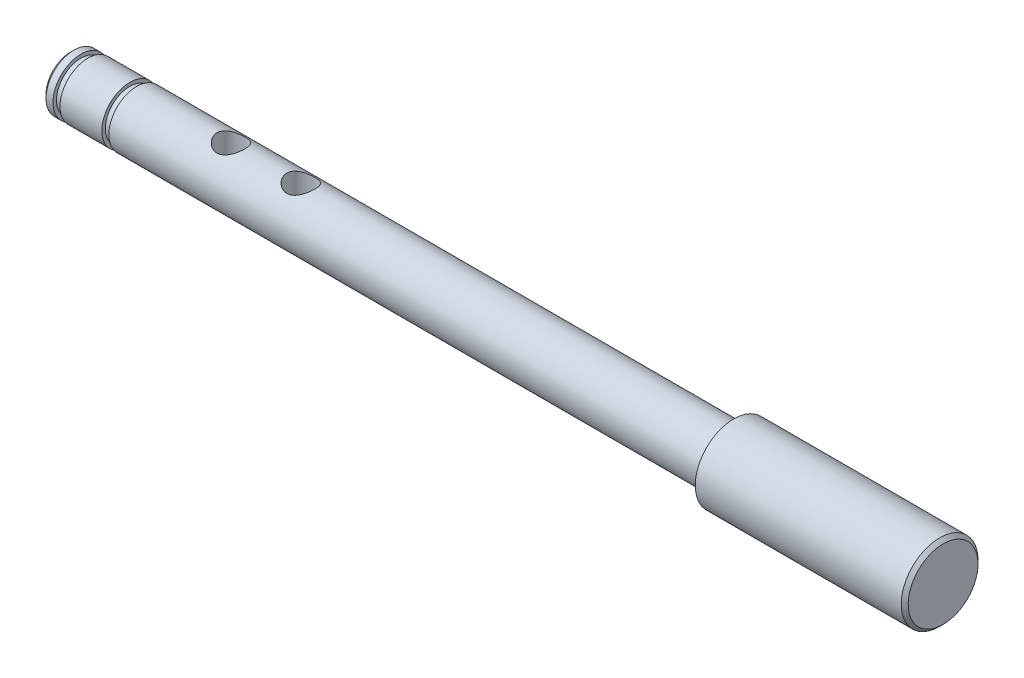
ISO-10303-21;
HEADER;
FILE_DESCRIPTION(('STEP AP214'),'2;1');
FILE_NAME('part.step','',(''),(''),'','','');
FILE_SCHEMA(('AUTOMOTIVE_DESIGN { 1 0 10303 214 1 1 1 1 }'));
ENDSEC;
DATA;
#1=APPLICATION_CONTEXT('core data for automotive mechanical design processes');
#2=APPLICATION_PROTOCOL_DEFINITION('international standard','automotive_design',2000,#1);
#3=PRODUCT_CONTEXT('',#1,'mechanical');
#4=PRODUCT('Part','Part','',(#3));
#5=PRODUCT_RELATED_PRODUCT_CATEGORY('part','',(#4));
#6=PRODUCT_DEFINITION_FORMATION('','',#4);
#7=PRODUCT_DEFINITION_CONTEXT('part definition',#1,'design');
#8=PRODUCT_DEFINITION('design','',#6,#7);
#9=PRODUCT_DEFINITION_SHAPE('','',#8);
#10=(LENGTH_UNIT() NAMED_UNIT(*) SI_UNIT(.MILLI.,.METRE.));
#11=(NAMED_UNIT(*) PLANE_ANGLE_UNIT() SI_UNIT($,.RADIAN.));
#12=(NAMED_UNIT(*) SI_UNIT($,.STERADIAN.) SOLID_ANGLE_UNIT());
#13=UNCERTAINTY_MEASURE_WITH_UNIT(LENGTH_MEASURE(1.E-05),#10,'distance_accuracy_value','');
#14=(GEOMETRIC_REPRESENTATION_CONTEXT(3) GLOBAL_UNCERTAINTY_ASSIGNED_CONTEXT((#13)) GLOBAL_UNIT_ASSIGNED_CONTEXT((#10,
#11,#12)) REPRESENTATION_CONTEXT('',''));
#15=CARTESIAN_POINT('',(0.,0.,0.));
#16=DIRECTION('',(0.,0.,1.));
#17=DIRECTION('',(1.,0.,0.));
#18=AXIS2_PLACEMENT_3D('',#15,#16,#17);
#19=CARTESIAN_POINT('',(-32.9998700625875,-1.79110198894605E-12,4.44089209850063E-13));
#20=DIRECTION('',(-1.,0.,0.));
#21=DIRECTION('',(0.,-1.,0.));
#22=AXIS2_PLACEMENT_3D('',#19,#20,#21);
#23=CYLINDRICAL_SURFACE('',#22,4.00000000000019);
#24=CARTESIAN_POINT('',(-23.4998700625875,-1.82145964977565E-12,0.));
#25=DIRECTION('',(-1.,0.,0.));
#26=DIRECTION('',(0.,-1.,0.));
#27=AXIS2_PLACEMENT_3D('',#24,#25,#26);
#28=CIRCLE('',#27,3.99999999999961);
#29=CARTESIAN_POINT('',(-23.4998700625875,-4.00000000000143,0.));
#30=VERTEX_POINT('',#29);
#31=EDGE_CURVE('E129',#30,#30,#28,.T.);
#32=ORIENTED_EDGE('',*,*,#31,.F.);
#33=EDGE_LOOP('',(#32));
#34=FACE_BOUND('',#33,.T.);
#35=CARTESIAN_POINT('',(60.9999999999999,-2.09901540593194E-12,0.));
#36=DIRECTION('',(-1.,0.,0.));
#37=DIRECTION('',(0.,-1.,0.));
#38=AXIS2_PLACEMENT_3D('',#35,#36,#37);
#39=CIRCLE('',#38,4.00000000000077);
#40=CARTESIAN_POINT('',(60.9999999999999,-4.00000000000288,0.));
#41=VERTEX_POINT('',#40);
#42=EDGE_CURVE('E133',#41,#41,#39,.T.);
#43=ORIENTED_EDGE('',*,*,#42,.T.);
#44=EDGE_LOOP('',(#43));
#45=FACE_BOUND('',#44,.T.);
#46=CARTESIAN_POINT('',(-9.99987006258754,3.46410161513611,-2.));
#47=CARTESIAN_POINT('',(-10.1040832680619,3.46411185715724,-1.99999158748818));
#48=CARTESIAN_POINT('',(-10.2084322391213,3.46887633544813,-1.99179963610415));
#49=CARTESIAN_POINT('',(-10.4139252398181,3.48724701668907,-1.95944672579986));
#50=CARTESIAN_POINT('',(-10.5150620658353,3.50087179788018,-1.9352522109561));
#51=CARTESIAN_POINT('',(-10.7107732190345,3.53498701489839,-1.87219981597994));
#52=CARTESIAN_POINT('',(-10.8053793214369,3.55544089069007,-1.83341988295927));
#53=CARTESIAN_POINT('',(-10.9867185130638,3.60085327290969,-1.74253507245076));
#54=CARTESIAN_POINT('',(-11.0734511760243,3.62581202301087,-1.6904294741005));
#55=CARTESIAN_POINT('',(-11.2444815057209,3.67993738819123,-1.56933307453707));
#56=CARTESIAN_POINT('',(-11.3279883301794,3.70928127464941,-1.49930407053465));
#57=CARTESIAN_POINT('',(-11.4826868431583,3.7674396538196,-1.34650761698157));
#58=CARTESIAN_POINT('',(-11.5538723887916,3.79625387610095,-1.26373385204793));
#59=CARTESIAN_POINT('',(-11.686604363776,3.85242953961492,-1.0809791263122));
#60=CARTESIAN_POINT('',(-11.7471775980108,3.87956212851074,-0.980214377886781));
#61=CARTESIAN_POINT('',(-11.8501517693746,3.92701512183998,-0.768314053336717));
#62=CARTESIAN_POINT('',(-11.8925641749384,3.94733982363466,-0.657185076311878));
#63=CARTESIAN_POINT('',(-11.9548793851188,3.97760922491889,-0.436089887818738));
#64=CARTESIAN_POINT('',(-11.9761691152796,3.98818960442572,-0.326603580968638));
#65=CARTESIAN_POINT('',(-12.0002022999565,4.0001516769101,-0.105141257404283));
#66=CARTESIAN_POINT('',(-12.0029569761838,4.00153893568768,0.00683321168550699));
#67=CARTESIAN_POINT('',(-11.9903767146424,3.99525963832959,0.219665048849873));
#68=CARTESIAN_POINT('',(-11.976594031544,3.98836991784217,0.320642398354399));
#69=CARTESIAN_POINT('',(-11.9341083747795,3.9674849051927,0.518627543836237));
#70=CARTESIAN_POINT('',(-11.9054042846354,3.95348908132604,0.615635042187779));
#71=CARTESIAN_POINT('',(-11.8337049304076,3.91943166575159,0.804618783139351));
#72=CARTESIAN_POINT('',(-11.7905174362434,3.8992888305824,0.896506847030569));
#73=CARTESIAN_POINT('',(-11.6913432301848,3.85475291973209,1.07195360302695));
#74=CARTESIAN_POINT('',(-11.635351935983,3.83035832314803,1.15550929767769));
#75=CARTESIAN_POINT('',(-11.5060793595215,3.77688788798292,1.32034732179684));
#76=CARTESIAN_POINT('',(-11.4316640059355,3.74758751996181,1.40066815005911));
#77=CARTESIAN_POINT('',(-11.2706906127272,3.68908681173455,1.54820874059617));
#78=CARTESIAN_POINT('',(-11.1841233180395,3.65988656531093,1.61541842314937));
#79=CARTESIAN_POINT('',(-10.9945736777395,3.60288312184806,1.73901066928533));
#80=CARTESIAN_POINT('',(-10.8908980164791,3.57528639981249,1.7944346299567));
#81=CARTESIAN_POINT('',(-10.6739947198695,3.52750900556985,1.8866382260028));
#82=CARTESIAN_POINT('',(-10.5607771965524,3.5073206009197,1.92343731642218));
#83=CARTESIAN_POINT('',(-10.3374410400221,3.47889271633905,1.97436042205059));
#84=CARTESIAN_POINT('',(-10.2277878245005,3.46983311696828,1.99005024424051));
#85=CARTESIAN_POINT('',(-10.0070673795545,3.46235838723054,2.00303389322317));
#86=CARTESIAN_POINT('',(-9.89600120434804,3.46393573778459,2.00034071463008));
#87=CARTESIAN_POINT('',(-9.68856222543021,3.47668673081004,1.97807208668794));
#88=CARTESIAN_POINT('',(-9.59191116037186,3.48679175013141,1.96037563342517));
#89=CARTESIAN_POINT('',(-9.40313449004562,3.51388043102517,1.91139256926558));
#90=CARTESIAN_POINT('',(-9.31101036109409,3.53086632009906,1.88010155724817));
#91=CARTESIAN_POINT('',(-9.12904740078249,3.57072444159149,1.80329517721064));
#92=CARTESIAN_POINT('',(-9.03951202888162,3.59383286485956,1.75718812738596));
#93=CARTESIAN_POINT('',(-8.86893151950867,3.64312238994329,1.65257412803216));
#94=CARTESIAN_POINT('',(-8.78789077555718,3.66930506710131,1.59406080866537));
#95=CARTESIAN_POINT('',(-8.62591252754489,3.72575996912507,1.45767433439747));
#96=CARTESIAN_POINT('',(-8.54627576116965,3.75613166308405,1.37829054462786));
#97=CARTESIAN_POINT('',(-8.40104558658272,3.81468469955633,1.20680899079926));
#98=CARTESIAN_POINT('',(-8.33545692206074,3.84286530015296,1.11470694931997));
#99=CARTESIAN_POINT('',(-8.21872261075491,3.89482723381699,0.917070725108073));
#100=CARTESIAN_POINT('',(-8.16800382642073,3.91847283343719,0.811246195112641));
#101=CARTESIAN_POINT('',(-8.08559425461783,3.95766709918613,0.591044729318167));
#102=CARTESIAN_POINT('',(-8.05388675890341,3.97322287353232,0.476675402917978));
#103=CARTESIAN_POINT('',(-8.01313293510242,3.99335016363007,0.253959364540128));
#104=CARTESIAN_POINT('',(-8.00227431392328,3.99879855814101,0.146022887268676));
#105=CARTESIAN_POINT('',(-7.99818352859188,4.00084260752206,-0.0702519714695585));
#106=CARTESIAN_POINT('',(-8.00494519405867,3.99744136141467,-0.178590198981228));
#107=CARTESIAN_POINT('',(-8.03470288690396,3.98267937668341,-0.38507598613647));
#108=CARTESIAN_POINT('',(-8.05659979989663,3.97185789309273,-0.483424641057028));
#109=CARTESIAN_POINT('',(-8.11452402239424,3.94384187353218,-0.674891898931207));
#110=CARTESIAN_POINT('',(-8.15055335829445,3.92664642364257,-0.768009749669449));
#111=CARTESIAN_POINT('',(-8.237324317579,3.88651861393011,-0.950846833596434));
#112=CARTESIAN_POINT('',(-8.28862928233956,3.8633723400523,-1.04025036572257));
#113=CARTESIAN_POINT('',(-8.40378535070577,3.81376266675854,-1.20954920326811));
#114=CARTESIAN_POINT('',(-8.46764221668912,3.78729774583261,-1.28944011444321));
#115=CARTESIAN_POINT('',(-8.61346669814701,3.73057218840415,-1.44582833859494));
#116=CARTESIAN_POINT('',(-8.69660424338807,3.70019591725901,-1.52119665879171));
#117=CARTESIAN_POINT('',(-8.87476229089389,3.64126158628396,-1.65732528393981));
#118=CARTESIAN_POINT('',(-8.96979319394814,3.61270515130617,-1.71807266521248));
#119=CARTESIAN_POINT('',(-9.17317895671781,3.55999186256587,-1.82486714716819));
#120=CARTESIAN_POINT('',(-9.28185997332297,3.53600256268367,-1.87038902381896));
#121=CARTESIAN_POINT('',(-9.45044818221872,3.50696218132201,-1.92395929504752));
#122=CARTESIAN_POINT('',(-9.50751788317847,3.49844389329232,-1.9393566614791));
#123=CARTESIAN_POINT('',(-9.62310262008791,3.48406059323369,-1.9650806980502));
#124=CARTESIAN_POINT('',(-9.68161661534188,3.47819372635886,-1.97541091343302));
#125=CARTESIAN_POINT('',(-9.78347085183488,3.47059023668593,-1.98872932961218));
#126=CARTESIAN_POINT('',(-9.82660311983768,3.4681638973165,-1.99295091983745));
#127=CARTESIAN_POINT('',(-9.91310575568049,3.46491740045012,-1.99858810035559));
#128=CARTESIAN_POINT('',(-9.95647613925427,3.46409735040327,-2.00000350293316));
#129=CARTESIAN_POINT('',(-9.99987006258754,3.46410161513611,-2.));
#130=B_SPLINE_CURVE_WITH_KNOTS('',3,(#46,#47,#48,#49,#50,#51,#52,#53,#54,#55,#56,#57,#58,#59,
#60,#61,#62,#63,#64,#65,#66,#67,#68,#69,#70,#71,#72,#73,#74,#75,#76,#77,#78,#79,#80,#81,#82,#83,
#84,#85,#86,#87,#88,#89,#90,#91,#92,#93,#94,#95,#96,#97,#98,#99,#100,#101,#102,#103,#104,#105,
#106,#107,#108,#109,#110,#111,#112,#113,#114,#115,#116,#117,#118,#119,#120,#121,#122,#123,#124,
#125,#126,#127,#128,#129),.UNSPECIFIED.,.T.,.F.,(4,2,2,2,2,2,2,2,2,2,2,2,2,2,2,2,2,2,2,2,2,2,2,
2,2,2,2,2,2,2,2,2,2,2,2,2,2,2,2,2,2,4),(0.,0.312464245189459,0.625585785649657,
0.937057191861695,1.24854545093126,1.5857246250373,1.9230714217281,2.28315784481574,
2.6430165393181,2.97726969939913,3.31132047376138,3.61632194973119,3.92134625038937,
4.23059069466335,4.53994598704602,4.87854382917855,5.21740096495926,5.57777683462976,
5.93777548427477,6.26924581712487,6.60048186380813,6.89548366852111,7.19058104876171,
7.49934592816229,7.80826972444165,8.15613487165315,8.50411729960509,8.86128362830021,
9.21813559621617,9.54224540783045,9.86624173592014,10.1688884974706,10.471578670281,
10.7872150144303,11.1029966020554,11.4502048370424,11.7977188569441,12.1562149808131,
12.3351395323575,12.5139387197528,12.6440387634038,12.7741475095883),.UNSPECIFIED.);
#131=CARTESIAN_POINT('',(-9.99987006258754,3.46410161513611,-2.));
#132=VERTEX_POINT('',#131);
#133=EDGE_CURVE('E53',#132,#132,#130,.T.);
#134=ORIENTED_EDGE('',*,*,#133,.F.);
#135=EDGE_LOOP('',(#134));
#136=FACE_BOUND('',#135,.T.);
#137=CARTESIAN_POINT('',(-7.9998700625875,-4.00000000000206,4.44089209850063E-13));
#138=CARTESIAN_POINT('',(-7.99987666722182,-3.99999426810289,0.105143925902829));
#139=CARTESIAN_POINT('',(-8.00821020882959,-3.99580982039721,0.210413199395417));
#140=CARTESIAN_POINT('',(-8.04117582327063,-3.97948312074522,0.417840470537916));
#141=CARTESIAN_POINT('',(-8.06583884858324,-3.96732575658045,0.519992173427284));
#142=CARTESIAN_POINT('',(-8.13025767982081,-3.93632558806958,0.717867089760966));
#143=CARTESIAN_POINT('',(-8.16995483108341,-3.91750878355284,0.813613605878493));
#144=CARTESIAN_POINT('',(-8.26301130531745,-3.87491553031734,0.996945233613578));
#145=CARTESIAN_POINT('',(-8.31636955108528,-3.8511394726726,1.08453098798055));
#146=CARTESIAN_POINT('',(-8.43890456155819,-3.79912516516331,1.25501563552428));
#147=CARTESIAN_POINT('',(-8.50884302106686,-3.77070398255281,1.33731042224468));
#148=CARTESIAN_POINT('',(-8.66091302108164,-3.71319940493692,1.48955888973443));
#149=CARTESIAN_POINT('',(-8.74305376613247,-3.68411552418277,1.55950316621401));
#150=CARTESIAN_POINT('',(-8.92483676163441,-3.62597902394902,1.690504000901));
#151=CARTESIAN_POINT('',(-9.02534225927952,-3.59710373940468,1.75045067110367));
#152=CARTESIAN_POINT('',(-9.2366047345601,-3.54571957544846,1.85233645378201));
#153=CARTESIAN_POINT('',(-9.3473543200331,-3.52320615214188,1.89428842993357));
#154=CARTESIAN_POINT('',(-9.56920027343143,-3.48915734075827,1.95626488437802));
#155=CARTESIAN_POINT('',(-9.67987896672241,-3.47704543167635,1.97745171416144));
#156=CARTESIAN_POINT('',(-9.90382773814659,-3.46363779897263,2.00085398661804));
#157=CARTESIAN_POINT('',(-10.0170951443299,-3.46233138686785,2.00308817674657));
#158=CARTESIAN_POINT('',(-10.2284421112184,-3.47021860514706,1.98937457434505));
#159=CARTESIAN_POINT('',(-10.3267181250337,-3.47817527324236,1.97556911907409));
#160=CARTESIAN_POINT('',(-10.5193138813337,-3.50152457467909,1.93387969811427));
#161=CARTESIAN_POINT('',(-10.6136323531982,-3.51691957663761,1.90599124779569));
#162=CARTESIAN_POINT('',(-10.798328327719,-3.55374952825692,1.83641956077242));
#163=CARTESIAN_POINT('',(-10.8885628601593,-3.57531681328208,1.79443013423244));
#164=CARTESIAN_POINT('',(-11.0611386477677,-3.62206808563017,1.6980833753363));
#165=CARTESIAN_POINT('',(-11.1434763337878,-3.64725369560588,1.64372048762505));
#166=CARTESIAN_POINT('',(-11.308912568074,-3.70226315806778,1.51613210982564));
#167=CARTESIAN_POINT('',(-11.39078380974,-3.73227020473702,1.4413889167388));
#168=CARTESIAN_POINT('',(-11.5413408997695,-3.79095246601025,1.27911115748318));
#169=CARTESIAN_POINT('',(-11.6100204466554,-3.81962703917811,1.19157051314902));
#170=CARTESIAN_POINT('',(-11.735241384647,-3.87403974566132,1.00103301166421));
#171=CARTESIAN_POINT('',(-11.791071007479,-3.89957968324215,0.897507183199387));
#172=CARTESIAN_POINT('',(-11.8840641206735,-3.94315762242686,0.680932430978287));
#173=CARTESIAN_POINT('',(-11.9212424326178,-3.96120157887312,0.567891152531313));
#174=CARTESIAN_POINT('',(-11.9728208700209,-3.98648667483078,0.34553298332217));
#175=CARTESIAN_POINT('',(-11.9888525340811,-3.99449876602824,0.236683061097352));
#176=CARTESIAN_POINT('',(-12.0027995248565,-4.00146026918411,0.0175591998992844));
#177=CARTESIAN_POINT('',(-12.0007234338664,-4.00041397442843,-0.0927140397392894));
#178=CARTESIAN_POINT('',(-11.97945668575,-3.98982384507076,-0.302465943971513));
#179=CARTESIAN_POINT('',(-11.9616049971276,-3.98094491376541,-0.402118816099414));
#180=CARTESIAN_POINT('',(-11.9113939187973,-3.95644342629886,-0.596813784603457));
#181=CARTESIAN_POINT('',(-11.8790329296805,-3.9408201266903,-0.691855371381754));
#182=CARTESIAN_POINT('',(-11.7998731297214,-3.9036850282738,-0.877777216898771));
#183=CARTESIAN_POINT('',(-11.7526879623548,-3.88201763539461,-0.968460794011268));
#184=CARTESIAN_POINT('',(-11.6456549912943,-3.83487948635036,-1.1409227233984));
#185=CARTESIAN_POINT('',(-11.5858017933967,-3.80940711134083,-1.22269725955321));
#186=CARTESIAN_POINT('',(-11.448349211926,-3.75416442672602,-1.38353537857841));
#187=CARTESIAN_POINT('',(-11.369584325697,-3.72421769687197,-1.4615441556378));
#188=CARTESIAN_POINT('',(-11.2000197600319,-3.66524783217838,-1.60371264223749));
#189=CARTESIAN_POINT('',(-11.1092118248916,-3.63622534800299,-1.66786277142379));
#190=CARTESIAN_POINT('',(-10.9125827542415,-3.58102384413187,-1.78341582895801));
#191=CARTESIAN_POINT('',(-10.8062475303984,-3.55505059178325,-1.8340509916001));
#192=CARTESIAN_POINT('',(-10.5848499274374,-3.51148144588472,-1.91616565186908));
#193=CARTESIAN_POINT('',(-10.4697990096537,-3.49387476443707,-1.94766983173414));
#194=CARTESIAN_POINT('',(-10.2460496168181,-3.47123002051814,-1.9877233749338));
#195=CARTESIAN_POINT('',(-10.1378015557171,-3.46514766930338,-1.99818599281056));
#196=CARTESIAN_POINT('',(-9.92097592825845,-3.46330709283415,-2.00137830875186));
#197=CARTESIAN_POINT('',(-9.81239852511176,-3.46754439252989,-1.99411569324614));
#198=CARTESIAN_POINT('',(-9.60890305952069,-3.48475724102361,-1.96385225118623));
#199=CARTESIAN_POINT('',(-9.51366912229817,-3.49686188965523,-1.94241662868547));
#200=CARTESIAN_POINT('',(-9.32825382373885,-3.52742032375513,-1.88635071644857));
#201=CARTESIAN_POINT('',(-9.23807409840337,-3.54587615139548,-1.85171618232014));
#202=CARTESIAN_POINT('',(-9.05862036061438,-3.58857060729281,-1.76763149060151));
#203=CARTESIAN_POINT('',(-8.96981425892961,-3.61311444792045,-1.71734227563125));
#204=CARTESIAN_POINT('',(-8.80132099022519,-3.66470663269924,-1.60430194327423));
#205=CARTESIAN_POINT('',(-8.72163860154532,-3.69175627591428,-1.5415443424827));
#206=CARTESIAN_POINT('',(-8.56358609787808,-3.74924646316395,-1.39640665332238));
#207=CARTESIAN_POINT('',(-8.48655185788691,-3.77969966613466,-1.31256884599404));
#208=CARTESIAN_POINT('',(-8.34734409571697,-3.8375550452007,-1.13230961246585));
#209=CARTESIAN_POINT('',(-8.28517858364764,-3.86495557252599,-1.03588144660989));
#210=CARTESIAN_POINT('',(-8.17739733716337,-3.91396019133281,-0.83186319356546));
#211=CARTESIAN_POINT('',(-8.13190172411468,-3.9355219298807,-0.72419900755306));
#212=CARTESIAN_POINT('',(-8.06025372707275,-3.97002682598179,-0.501484202275896));
#213=CARTESIAN_POINT('',(-8.03404636897598,-3.98299446726344,-0.386455599178016));
#214=CARTESIAN_POINT('',(-8.01207524041602,-3.99390923827163,-0.225203892981608));
#215=CARTESIAN_POINT('',(-8.00750478085488,-3.99618730680708,-0.180323758882888));
#216=CARTESIAN_POINT('',(-8.0014007315594,-3.99923393953836,-0.0903034636098355));
#217=CARTESIAN_POINT('',(-7.9998672256471,-4.00000246206968,-0.0451632952928621));
#218=CARTESIAN_POINT('',(-7.9998700625875,-4.00000000000206,4.44089209850063E-13));
#219=B_SPLINE_CURVE_WITH_KNOTS('',3,(#137,#138,#139,#140,#141,#142,#143,#144,#145,#146,#147,
#148,#149,#150,#151,#152,#153,#154,#155,#156,#157,#158,#159,#160,#161,#162,#163,#164,#165,#166,
#167,#168,#169,#170,#171,#172,#173,#174,#175,#176,#177,#178,#179,#180,#181,#182,#183,#184,#185,
#186,#187,#188,#189,#190,#191,#192,#193,#194,#195,#196,#197,#198,#199,#200,#201,#202,#203,#204,
#205,#206,#207,#208,#209,#210,#211,#212,#213,#214,#215,#216,#217,#218),.UNSPECIFIED.,.T.,.F.,(4,
2,2,2,2,2,2,2,2,2,2,2,2,2,2,2,2,2,2,2,2,2,2,2,2,2,2,2,2,2,2,2,2,2,2,2,2,2,2,2,4),(0.,
0.315248514840347,0.631096299417941,0.945724310984405,1.26032752116317,1.59396351743618,
1.92785247530808,2.28763452861518,2.64715895796579,2.98516024280469,3.3228271465805,
3.62011424818653,3.91749607851367,4.22180480336992,4.52625042520472,4.86929882667772,
5.21251069197369,5.57166044428859,5.93052433824521,6.25966580942672,6.58865129022949,
6.89213813012243,7.19565843261866,7.50785712055821,7.82018901496719,8.16319221288871,
8.50643177230896,8.86629364323485,9.22569023890927,9.55058615006111,9.87534119729376,
10.1691586049772,10.463070575767,10.7767291356058,11.0905512228729,11.4425048551438,
11.7946476676253,12.1492802732707,12.502898172423,12.6383056026785,12.7737167702216),.UNSPECIFIED.);
#220=CARTESIAN_POINT('',(-7.9998700625875,-4.00000000000206,4.44089209850063E-13));
#221=VERTEX_POINT('',#220);
#222=EDGE_CURVE('E59',#221,#221,#219,.T.);
#223=ORIENTED_EDGE('',*,*,#222,.F.);
#224=EDGE_LOOP('',(#223));
#225=FACE_BOUND('',#224,.T.);
#226=CARTESIAN_POINT('',(0.000129937412454706,3.46410161513607,-1.99999999999956));
#227=CARTESIAN_POINT('',(-0.104083268061892,3.4641118571572,-1.99999158748747));
#228=CARTESIAN_POINT('',(-0.208432239121368,3.46887633544809,-1.99179963610395));
#229=CARTESIAN_POINT('',(-0.413925239818179,3.48724701668905,-1.95944672580006));
#230=CARTESIAN_POINT('',(-0.515062065835327,3.50087179788017,-1.93525221095617));
#231=CARTESIAN_POINT('',(-0.71077321903449,3.53498701489836,-1.87219981597987));
#232=CARTESIAN_POINT('',(-0.80537932143681,3.55544089069001,-1.8334198829592));
#233=CARTESIAN_POINT('',(-0.98671851306371,3.60085327290963,-1.74253507245092));
#234=CARTESIAN_POINT('',(-1.07345117602432,3.62581202301085,-1.69042947410091));
#235=CARTESIAN_POINT('',(-1.24448150572094,3.67993738819121,-1.56933307453751));
#236=CARTESIAN_POINT('',(-1.32798833017935,3.70928127464935,-1.49930407053486));
#237=CARTESIAN_POINT('',(-1.48268684315818,3.76743965381953,-1.34650761698155));
#238=CARTESIAN_POINT('',(-1.55387238879155,3.7962538761009,-1.26373385204794));
#239=CARTESIAN_POINT('',(-1.68660436377601,3.8524295396149,-1.08097912631222));
#240=CARTESIAN_POINT('',(-1.74717759801078,3.87956212851071,-0.980214377886777));
#241=CARTESIAN_POINT('',(-1.85015176937458,3.92701512183994,-0.768314053336699));
#242=CARTESIAN_POINT('',(-1.89256417493836,3.94733982363463,-0.657185076311871));
#243=CARTESIAN_POINT('',(-1.95487938511877,3.97760922491886,-0.436089887818723));
#244=CARTESIAN_POINT('',(-1.97616911527964,3.98818960442569,-0.326603580968603));
#245=CARTESIAN_POINT('',(-2.00020229995655,4.00015167691007,-0.105141257404209));
#246=CARTESIAN_POINT('',(-2.00295697618383,4.00153893568764,0.00683321168560059));
#247=CARTESIAN_POINT('',(-1.99037671464243,3.99525963832955,0.219665048849963));
#248=CARTESIAN_POINT('',(-1.97659403154396,3.98836991784213,0.320642398354466));
#249=CARTESIAN_POINT('',(-1.93410837477947,3.96748490519266,0.518627543836267));
#250=CARTESIAN_POINT('',(-1.90540428463544,3.953489081326,0.615635042187793));
#251=CARTESIAN_POINT('',(-1.83370493040765,3.91943166575156,0.804618783139355));
#252=CARTESIAN_POINT('',(-1.79051743624342,3.89928883058237,0.896506847030576));
#253=CARTESIAN_POINT('',(-1.69134323018478,3.85475291973205,1.07195360302694));
#254=CARTESIAN_POINT('',(-1.63535193598301,3.830358323148,1.15550929767767));
#255=CARTESIAN_POINT('',(-1.50607935952159,3.77688788798291,1.32034732179683));
#256=CARTESIAN_POINT('',(-1.43166400593557,3.74758751996183,1.40066815005911));
#257=CARTESIAN_POINT('',(-1.27069061272725,3.68908681173455,1.54820874059597));
#258=CARTESIAN_POINT('',(-1.18412331803951,3.65988656531089,1.61541842314894));
#259=CARTESIAN_POINT('',(-0.994573677739462,3.60288312184801,1.73901066928491));
#260=CARTESIAN_POINT('',(-0.890898016479186,3.57528639981248,1.79443462995654));
#261=CARTESIAN_POINT('',(-0.673994719869603,3.52750900556984,1.88663822600288));
#262=CARTESIAN_POINT('',(-0.560777196552495,3.50732060091966,1.92343731642223));
#263=CARTESIAN_POINT('',(-0.337441040022057,3.478892716339,1.97436042205054));
#264=CARTESIAN_POINT('',(-0.227787824500535,3.46983311696824,1.9900502442404));
#265=CARTESIAN_POINT('',(-0.00706737955454028,3.46235838723051,2.0030338932233));
#266=CARTESIAN_POINT('',(0.103998795651965,3.46393573778456,2.00034071463051));
#267=CARTESIAN_POINT('',(0.31143777456981,3.47668673081001,1.9780720866884));
#268=CARTESIAN_POINT('',(0.408088839628164,3.48679175013138,1.96037563342539));
#269=CARTESIAN_POINT('',(0.59686550995437,3.51388043102512,1.91139256926536));
#270=CARTESIAN_POINT('',(0.688989638905858,3.530866320099,1.88010155724773));
#271=CARTESIAN_POINT('',(0.870952599217511,3.57072444159145,1.80329517721022));
#272=CARTESIAN_POINT('',(0.960487971118472,3.59383286485955,1.7571881273858));
#273=CARTESIAN_POINT('',(1.13106848049145,3.64312238994329,1.65257412803221));
#274=CARTESIAN_POINT('',(1.21210922444287,3.66930506710129,1.59406080866538));
#275=CARTESIAN_POINT('',(1.37408747245503,3.72575996912501,1.45767433439747));
#276=CARTESIAN_POINT('',(1.45372423883022,3.75613166308396,1.37829054462791));
#277=CARTESIAN_POINT('',(1.5989544134172,3.81468469955626,1.2068089907995));
#278=CARTESIAN_POINT('',(1.66454307793926,3.84286530015294,1.11470694932035));
#279=CARTESIAN_POINT('',(1.78127738924513,3.89482723381699,0.917070725108479));
#280=CARTESIAN_POINT('',(1.83199617357923,3.91847283343714,0.811246195112916));
#281=CARTESIAN_POINT('',(1.9144057453821,3.95766709918605,0.591044729318267));
#282=CARTESIAN_POINT('',(1.94611324109656,3.97322287353225,0.476675402918035));
#283=CARTESIAN_POINT('',(1.98686706489759,3.99335016363003,0.253959364540137));
#284=CARTESIAN_POINT('',(1.99772568607673,3.99879855814098,0.146022887268684));
#285=CARTESIAN_POINT('',(2.00181647140814,4.00084260752202,-0.0702519714695544));
#286=CARTESIAN_POINT('',(1.99505480594133,3.99744136141463,-0.178590198981227));
#287=CARTESIAN_POINT('',(1.96529711309602,3.98267937668335,-0.385075986136524));
#288=CARTESIAN_POINT('',(1.94340020010332,3.97185789309267,-0.48342464105713));
#289=CARTESIAN_POINT('',(1.88547597760574,3.94384187353213,-0.674891898931427));
#290=CARTESIAN_POINT('',(1.84944664170557,3.92664642364254,-0.768009749669739));
#291=CARTESIAN_POINT('',(1.76267568242106,3.8865186139301,-0.950846833596672));
#292=CARTESIAN_POINT('',(1.71137071766051,3.86337234005228,-1.04025036572269));
#293=CARTESIAN_POINT('',(1.59621464929424,3.81376266675851,-1.20954920326793));
#294=CARTESIAN_POINT('',(1.53235778331082,3.78729774583255,-1.28944011444282));
#295=CARTESIAN_POINT('',(1.38653330185298,3.73057218840411,-1.44582833859454));
#296=CARTESIAN_POINT('',(1.30339575661203,3.700195917259,-1.52119665879154));
#297=CARTESIAN_POINT('',(1.12523770910625,3.64126158628397,-1.65732528393983));
#298=CARTESIAN_POINT('',(1.03020680605193,3.61270515130614,-1.71807266521248));
#299=CARTESIAN_POINT('',(0.826821043282177,3.55999186256583,-1.82486714716818));
#300=CARTESIAN_POINT('',(0.71814002667702,3.53600256268363,-1.87038902381896));
#301=CARTESIAN_POINT('',(0.549551817781274,3.50696218132197,-1.92395929504754));
#302=CARTESIAN_POINT('',(0.492482116821534,3.49844389329228,-1.93935666147912));
#303=CARTESIAN_POINT('',(0.376897379912103,3.48406059323365,-1.96508069805019));
#304=CARTESIAN_POINT('',(0.318383384658127,3.47819372635882,-1.97541091343298));
#305=CARTESIAN_POINT('',(0.216529148165131,3.47059023668589,-1.98872932961221));
#306=CARTESIAN_POINT('',(0.173396880162332,3.46816389731647,-1.99295091983755));
#307=CARTESIAN_POINT('',(0.0868942443195176,3.46491740045008,-1.9985881003555));
#308=CARTESIAN_POINT('',(0.043523860745736,3.46409735040323,-2.00000350293283));
#309=CARTESIAN_POINT('',(0.000129937412454706,3.46410161513607,-1.99999999999956));
#310=B_SPLINE_CURVE_WITH_KNOTS('',3,(#226,#227,#228,#229,#230,#231,#232,#233,#234,#235,#236,
#237,#238,#239,#240,#241,#242,#243,#244,#245,#246,#247,#248,#249,#250,#251,#252,#253,#254,#255,
#256,#257,#258,#259,#260,#261,#262,#263,#264,#265,#266,#267,#268,#269,#270,#271,#272,#273,#274,
#275,#276,#277,#278,#279,#280,#281,#282,#283,#284,#285,#286,#287,#288,#289,#290,#291,#292,#293,
#294,#295,#296,#297,#298,#299,#300,#301,#302,#303,#304,#305,#306,#307,#308,#309),.UNSPECIFIED.,
.T.,.F.,(4,2,2,2,2,2,2,2,2,2,2,2,2,2,2,2,2,2,2,2,2,2,2,2,2,2,2,2,2,2,2,2,2,2,2,2,2,2,2,2,2,4),
(0.,0.312464245189471,0.625585785649625,0.937057191861542,1.248545450931,1.58572462503717,
1.92307142172812,2.28315784481577,2.64301653931811,2.9772696993992,3.3113204737615,
3.61632194973126,3.92134625038939,4.23059069466338,4.53994598704603,4.87854382917843,
5.21740096495901,5.5777768346296,5.93777548427472,6.26924581712485,6.60048186380808,
6.89548366852114,7.19058104876189,7.4993459281624,7.80826972444162,8.15613487165294,
8.50411729960472,8.86128362830003,9.21813559621619,9.54224540783047,9.86624173592016,
10.1688884974708,10.4715786702814,10.7872150144303,11.1029966020551,11.4502048370422,
11.7977188569441,12.1562149808131,12.3351395323575,12.5139387197528,12.6440387634038,
12.7741475095883),.UNSPECIFIED.);
#311=CARTESIAN_POINT('',(0.000129937412454706,3.46410161513607,-1.99999999999956));
#312=VERTEX_POINT('',#311);
#313=EDGE_CURVE('E142',#312,#312,#310,.T.);
#314=ORIENTED_EDGE('',*,*,#313,.F.);
#315=EDGE_LOOP('',(#314));
#316=FACE_BOUND('',#315,.T.);
#317=CARTESIAN_POINT('',(2.00012993741251,-4.0000000000021,0.));
#318=CARTESIAN_POINT('',(2.00012333277821,-3.99999426810295,0.105143925902462));
#319=CARTESIAN_POINT('',(1.99178979117046,-3.99580982039726,0.210413199395131));
#320=CARTESIAN_POINT('',(1.95882417672941,-3.97948312074526,0.417840470537779));
#321=CARTESIAN_POINT('',(1.93416115141679,-3.96732575658049,0.519992173427217));
#322=CARTESIAN_POINT('',(1.8697423201792,-3.93632558806961,0.717867089760965));
#323=CARTESIAN_POINT('',(1.8300451689166,-3.91750878355287,0.813613605878492));
#324=CARTESIAN_POINT('',(1.73698869468257,-3.87491553031737,0.996945233613577));
#325=CARTESIAN_POINT('',(1.68363044891473,-3.85113947267264,1.08453098798055));
#326=CARTESIAN_POINT('',(1.56109543844182,-3.79912516516334,1.25501563552429));
#327=CARTESIAN_POINT('',(1.49115697893315,-3.77070398255283,1.33731042224469));
#328=CARTESIAN_POINT('',(1.33908697891836,-3.71319940493695,1.48955888973444));
#329=CARTESIAN_POINT('',(1.25694623386752,-3.68411552418281,1.55950316621401));
#330=CARTESIAN_POINT('',(1.07516323836558,-3.62597902394906,1.69050400090099));
#331=CARTESIAN_POINT('',(0.974657740720487,-3.59710373940471,1.75045067110367));
#332=CARTESIAN_POINT('',(0.763395265439912,-3.54571957544849,1.85233645378202));
#333=CARTESIAN_POINT('',(0.652645679966908,-3.5232061521419,1.89428842993356));
#334=CARTESIAN_POINT('',(0.430799726568572,-3.4891573407583,1.95626488437803));
#335=CARTESIAN_POINT('',(0.320121033277583,-3.47704543167638,1.97745171416146));
#336=CARTESIAN_POINT('',(0.0961722618534048,-3.46363779897266,2.00085398661804));
#337=CARTESIAN_POINT('',(-0.0170951443299191,-3.46233138686788,2.00308817674653));
#338=CARTESIAN_POINT('',(-0.228442111218376,-3.4702186051471,1.98937457434508));
#339=CARTESIAN_POINT('',(-0.326718125033794,-3.4781752732424,1.97556911907419));
#340=CARTESIAN_POINT('',(-0.519313881333747,-3.50152457467913,1.93387969811415));
#341=CARTESIAN_POINT('',(-0.613632353198209,-3.51691957663763,1.90599124779527));
#342=CARTESIAN_POINT('',(-0.798328327718962,-3.55374952825695,1.83641956077197));
#343=CARTESIAN_POINT('',(-0.888562860159377,-3.57531681328215,1.79443013423228));
#344=CARTESIAN_POINT('',(-1.06113864776781,-3.62206808563024,1.69808337533633));
#345=CARTESIAN_POINT('',(-1.14347633378782,-3.64725369560592,1.64372048762496));
#346=CARTESIAN_POINT('',(-1.308912568074,-3.7022631580678,1.5161321098255));
#347=CARTESIAN_POINT('',(-1.39078380973997,-3.73227020473705,1.44138891673875));
#348=CARTESIAN_POINT('',(-1.54134089976949,-3.7909524660103,1.27911115748319));
#349=CARTESIAN_POINT('',(-1.61002044665537,-3.81962703917814,1.19157051314902));
#350=CARTESIAN_POINT('',(-1.73524138464701,-3.87403974566137,1.00103301166415));
#351=CARTESIAN_POINT('',(-1.79107100747905,-3.89957968324223,0.897507183199269));
#352=CARTESIAN_POINT('',(-1.88406412067356,-3.94315762242693,0.680932430978016));
#353=CARTESIAN_POINT('',(-1.92124243261783,-3.96120157887316,0.567891152530945));
#354=CARTESIAN_POINT('',(-1.97282087002085,-3.9864866748308,0.345532983321789));
#355=CARTESIAN_POINT('',(-1.98885253408111,-3.99449876602828,0.236683061097058));
#356=CARTESIAN_POINT('',(-2.00279952485653,-4.00146026918415,0.0175591998991419));
#357=CARTESIAN_POINT('',(-2.00072343386645,-4.00041397442847,-0.0927140397393664));
#358=CARTESIAN_POINT('',(-1.97945668574999,-3.98982384507078,-0.302465943971579));
#359=CARTESIAN_POINT('',(-1.96160499712749,-3.98094491376541,-0.402118816099533));
#360=CARTESIAN_POINT('',(-1.91139391879727,-3.95644342629887,-0.596813784603741));
#361=CARTESIAN_POINT('',(-1.87903292968056,-3.94082012669035,-0.691855371382151));
#362=CARTESIAN_POINT('',(-1.79987312972138,-3.90368502827384,-0.877777216899143));
#363=CARTESIAN_POINT('',(-1.75268796235475,-3.8820176353946,-0.968460794011507));
#364=CARTESIAN_POINT('',(-1.6456549912942,-3.83487948635034,-1.14092272339848));
#365=CARTESIAN_POINT('',(-1.58580179339668,-3.80940711134085,-1.22269725955325));
#366=CARTESIAN_POINT('',(-1.44834921192605,-3.75416442672606,-1.38353537857841));
#367=CARTESIAN_POINT('',(-1.36958432569702,-3.724217696872,-1.46154415563779));
#368=CARTESIAN_POINT('',(-1.20001976003186,-3.66524783217841,-1.60371264223749));
#369=CARTESIAN_POINT('',(-1.10921182489163,-3.63622534800303,-1.6678627714238));
#370=CARTESIAN_POINT('',(-0.91258275424149,-3.58102384413189,-1.78341582895801));
#371=CARTESIAN_POINT('',(-0.806247530398279,-3.55505059178326,-1.83405099160006));
#372=CARTESIAN_POINT('',(-0.584849927437293,-3.51148144588474,-1.91616565186919));
#373=CARTESIAN_POINT('',(-0.469799009653631,-3.49387476443709,-1.94766983173445));
#374=CARTESIAN_POINT('',(-0.246049616818127,-3.47123002051817,-1.98772337493414));
#375=CARTESIAN_POINT('',(-0.137801555717015,-3.46514766930342,-1.99818599281076));
#376=CARTESIAN_POINT('',(0.0790240717415797,-3.46330709283417,-2.00137830875167));
#377=CARTESIAN_POINT('',(0.187601474888244,-3.46754439252992,-1.99411569324567));
#378=CARTESIAN_POINT('',(0.391096940479355,-3.48475724102365,-1.96385225118581));
#379=CARTESIAN_POINT('',(0.486330877701928,-3.49686188965528,-1.94241662868534));
#380=CARTESIAN_POINT('',(0.671746176261256,-3.52742032375518,-1.88635071644865));
#381=CARTESIAN_POINT('',(0.761925901596696,-3.54587615139552,-1.85171618232015));
#382=CARTESIAN_POINT('',(0.941379639385642,-3.58857060729284,-1.76763149060149));
#383=CARTESIAN_POINT('',(1.03018574107041,-3.61311444792049,-1.71734227563125));
#384=CARTESIAN_POINT('',(1.19867900977481,-3.66470663269927,-1.60430194327424));
#385=CARTESIAN_POINT('',(1.27836139845467,-3.69175627591431,-1.54154434248269));
#386=CARTESIAN_POINT('',(1.43641390212203,-3.74924646316402,-1.39640665332232));
#387=CARTESIAN_POINT('',(1.51344814211334,-3.77969966613479,-1.31256884599395));
#388=CARTESIAN_POINT('',(1.65265590428321,-3.83755504520081,-1.13230961246542));
#389=CARTESIAN_POINT('',(1.71482141635233,-3.86495557252601,-1.03588144660915));
#390=CARTESIAN_POINT('',(1.8226026628365,-3.91396019133279,-0.8318631935647));
#391=CARTESIAN_POINT('',(1.86809827588536,-3.93552192988074,-0.724199007552617));
#392=CARTESIAN_POINT('',(1.93974627292737,-3.97002682598187,-0.501484202275951));
#393=CARTESIAN_POINT('',(1.96595363102406,-3.98299446726351,-0.386455599178253));
#394=CARTESIAN_POINT('',(1.98792475958397,-3.99390923827166,-0.225203892982051));
#395=CARTESIAN_POINT('',(1.9924952191451,-3.99618730680709,-0.180323758883334));
#396=CARTESIAN_POINT('',(1.99859926844059,-3.99923393953838,-0.0903034636102824));
#397=CARTESIAN_POINT('',(2.00013277435289,-4.0000024620697,-0.0451632952933079));
#398=CARTESIAN_POINT('',(2.00012993741251,-4.0000000000021,0.));
#399=B_SPLINE_CURVE_WITH_KNOTS('',3,(#317,#318,#319,#320,#321,#322,#323,#324,#325,#326,#327,
#328,#329,#330,#331,#332,#333,#334,#335,#336,#337,#338,#339,#340,#341,#342,#343,#344,#345,#346,
#347,#348,#349,#350,#351,#352,#353,#354,#355,#356,#357,#358,#359,#360,#361,#362,#363,#364,#365,
#366,#367,#368,#369,#370,#371,#372,#373,#374,#375,#376,#377,#378,#379,#380,#381,#382,#383,#384,
#385,#386,#387,#388,#389,#390,#391,#392,#393,#394,#395,#396,#397,#398),.UNSPECIFIED.,.T.,.F.,(4,
2,2,2,2,2,2,2,2,2,2,2,2,2,2,2,2,2,2,2,2,2,2,2,2,2,2,2,2,2,2,2,2,2,2,2,2,2,2,2,4),(0.,
0.315248514840578,0.631096299418385,0.945724310984844,1.26032752116362,1.59396351743663,
1.92785247530854,2.28763452861562,2.64715895796623,2.98516024280515,3.32282714658095,
3.62011424818703,3.91749607851425,4.22180480337046,4.52625042520518,4.86929882667813,
5.21251069197408,5.57166044428919,5.93052433824602,6.2596658094273,6.58865129022986,
6.89213813012301,7.19565843261944,7.50785712055879,7.82018901496758,8.1631922128891,
8.50643177230937,8.86629364323536,9.22569023890979,9.55058615006157,9.87534119729427,
10.1691586049777,10.4630705757674,10.7767291356062,11.0905512228733,11.4425048551445,
11.7946476676264,12.1492802732712,12.5028981724229,12.6383056026784,12.7737167702215),.UNSPECIFIED.);
#400=CARTESIAN_POINT('',(2.00012993741251,-4.0000000000021,0.));
#401=VERTEX_POINT('',#400);
#402=EDGE_CURVE('E36',#401,#401,#399,.T.);
#403=ORIENTED_EDGE('',*,*,#402,.F.);
#404=EDGE_LOOP('',(#403));
#405=FACE_BOUND('',#404,.T.);
#406=ADVANCED_FACE('F32',(#34,#45,#136,#225,#316,#405),#23,.T.);
#407=CARTESIAN_POINT('',(91.9999999999991,4.99999999999946,0.));
#408=DIRECTION('',(-1.,0.,0.));
#409=DIRECTION('',(0.,-1.,0.));
#410=AXIS2_PLACEMENT_3D('',#407,#408,#409);
#411=PLANE('',#410);
#412=CARTESIAN_POINT('',(91.9999999999987,-2.19962936753859E-12,8.88178419700125E-13));
#413=DIRECTION('',(-1.,0.,0.));
#414=DIRECTION('',(0.,-1.,0.));
#415=AXIS2_PLACEMENT_3D('',#412,#413,#414);
#416=CIRCLE('',#415,5.00000000000165);
#417=CARTESIAN_POINT('',(91.9999999999987,-5.00000000000386,8.88178419700125E-13));
#418=VERTEX_POINT('',#417);
#419=EDGE_CURVE('E10',#418,#418,#416,.T.);
#420=ORIENTED_EDGE('',*,*,#419,.F.);
#421=EDGE_LOOP('',(#420));
#422=FACE_BOUND('',#421,.T.);
#423=ADVANCED_FACE('F34',(#422),#411,.F.);
#424=CARTESIAN_POINT('',(91.9999999999987,-2.19962936753859E-12,8.88178419700125E-13));
#425=DIRECTION('',(-1.,0.,0.));
#426=DIRECTION('',(0.,-1.,0.));
#427=AXIS2_PLACEMENT_3D('',#424,#425,#426);
#428=CONICAL_SURFACE('',#427,5.00000000000165,0.785398163396558);
#429=CARTESIAN_POINT('',(91.4999999999994,-2.19615992058664E-12,8.88178419700125E-13));
#430=DIRECTION('',(-1.,0.,0.));
#431=DIRECTION('',(0.,-1.,0.));
#432=AXIS2_PLACEMENT_3D('',#429,#430,#431);
#433=CIRCLE('',#432,5.50000000000004);
#434=CARTESIAN_POINT('',(91.4999999999994,-5.50000000000225,8.88178419700125E-13));
#435=VERTEX_POINT('',#434);
#436=EDGE_CURVE('E44',#435,#435,#433,.T.);
#437=ORIENTED_EDGE('',*,*,#436,.F.);
#438=EDGE_LOOP('',(#437));
#439=FACE_BOUND('',#438,.T.);
#440=ORIENTED_EDGE('',*,*,#419,.T.);
#441=EDGE_LOOP('',(#440));
#442=FACE_BOUND('',#441,.T.);
#443=ADVANCED_FACE('F124',(#439,#442),#428,.T.);
#444=CARTESIAN_POINT('',(-32.9998700625875,-1.79110198894605E-12,4.44089209850063E-13));
#445=DIRECTION('',(-1.,0.,0.));
#446=DIRECTION('',(0.,-1.,0.));
#447=AXIS2_PLACEMENT_3D('',#444,#445,#446);
#448=CYLINDRICAL_SURFACE('',#447,5.50000000000044);
#449=CARTESIAN_POINT('',(61.9999999999998,-2.1016174911459E-12,0.));
#450=DIRECTION('',(-1.,0.,0.));
#451=DIRECTION('',(0.,-1.,0.));
#452=AXIS2_PLACEMENT_3D('',#449,#450,#451);
#453=CIRCLE('',#452,5.50000000000083);
#454=CARTESIAN_POINT('',(61.9999999999998,-5.50000000000294,0.));
#455=VERTEX_POINT('',#454);
#456=EDGE_CURVE('E49',#455,#455,#453,.T.);
#457=ORIENTED_EDGE('',*,*,#456,.F.);
#458=EDGE_LOOP('',(#457));
#459=FACE_BOUND('',#458,.T.);
#460=ORIENTED_EDGE('',*,*,#436,.T.);
#461=EDGE_LOOP('',(#460));
#462=FACE_BOUND('',#461,.T.);
#463=ADVANCED_FACE('F211',(#459,#462),#448,.T.);
#464=CARTESIAN_POINT('',(61.9999999999999,5.49999999999873,4.44089209850063E-13));
#465=DIRECTION('',(1.,0.,0.));
#466=DIRECTION('',(0.,1.,0.));
#467=AXIS2_PLACEMENT_3D('',#464,#465,#466);
#468=PLANE('',#467);
#469=CARTESIAN_POINT('',(62.,-2.1016174911459E-12,0.));
#470=DIRECTION('',(-1.,0.,0.));
#471=DIRECTION('',(0.,-1.,0.));
#472=AXIS2_PLACEMENT_3D('',#469,#470,#471);
#473=CIRCLE('',#472,5.00000000000111);
#474=CARTESIAN_POINT('',(62.,-5.00000000000322,0.));
#475=VERTEX_POINT('',#474);
#476=EDGE_CURVE('E268',#475,#475,#473,.T.);
#477=ORIENTED_EDGE('',*,*,#476,.F.);
#478=EDGE_LOOP('',(#477));
#479=FACE_BOUND('',#478,.T.);
#480=ORIENTED_EDGE('',*,*,#456,.T.);
#481=EDGE_LOOP('',(#480));
#482=FACE_BOUND('',#481,.T.);
#483=ADVANCED_FACE('F115',(#479,#482),#468,.F.);
#484=CARTESIAN_POINT('',(60.9999999999999,-2.09901540593194E-12,0.));
#485=DIRECTION('',(-1.,0.,0.));
#486=DIRECTION('',(0.,-1.,0.));
#487=AXIS2_PLACEMENT_3D('',#484,#485,#486);
#488=TOROIDAL_SURFACE('',#487,5.0000000000011,1.00000000000011);
#489=ORIENTED_EDGE('',*,*,#42,.F.);
#490=EDGE_LOOP('',(#489));
#491=FACE_BOUND('',#490,.T.);
#492=ORIENTED_EDGE('',*,*,#476,.T.);
#493=EDGE_LOOP('',(#492));
#494=FACE_BOUND('',#493,.T.);
#495=ADVANCED_FACE('F110',(#491,#494),#488,.F.);
#496=CARTESIAN_POINT('',(-23.4998700625875,3.49999999999806,0.));
#497=DIRECTION('',(1.,0.,0.));
#498=DIRECTION('',(0.,1.,0.));
#499=AXIS2_PLACEMENT_3D('',#496,#497,#498);
#500=PLANE('',#499);
#501=CARTESIAN_POINT('',(-23.4998700625875,-1.82145964977565E-12,0.));
#502=DIRECTION('',(-1.,0.,0.));
#503=DIRECTION('',(0.,-1.,0.));
#504=AXIS2_PLACEMENT_3D('',#501,#502,#503);
#505=CIRCLE('',#504,3.49999999999988);
#506=CARTESIAN_POINT('',(-23.4998700625875,-3.50000000000171,0.));
#507=VERTEX_POINT('',#506);
#508=EDGE_CURVE('E274',#507,#507,#505,.T.);
#509=ORIENTED_EDGE('',*,*,#508,.F.);
#510=EDGE_LOOP('',(#509));
#511=FACE_BOUND('',#510,.T.);
#512=ORIENTED_EDGE('',*,*,#31,.T.);
#513=EDGE_LOOP('',(#512));
#514=FACE_BOUND('',#513,.T.);
#515=ADVANCED_FACE('F107',(#511,#514),#500,.F.);
#516=CARTESIAN_POINT('',(-32.9998700625875,-1.79110198894605E-12,4.44089209850063E-13));
#517=DIRECTION('',(-1.,0.,0.));
#518=DIRECTION('',(0.,-1.,0.));
#519=AXIS2_PLACEMENT_3D('',#516,#517,#518);
#520=CYLINDRICAL_SURFACE('',#519,3.49999999999988);
#521=CARTESIAN_POINT('',(-24.4998700625878,-1.81538811760973E-12,0.));
#522=DIRECTION('',(-1.,0.,0.));
#523=DIRECTION('',(0.,-1.,0.));
#524=AXIS2_PLACEMENT_3D('',#521,#522,#523);
#525=CIRCLE('',#524,3.49999999999988);
#526=CARTESIAN_POINT('',(-24.4998700625878,-3.5000000000017,0.));
#527=VERTEX_POINT('',#526);
#528=EDGE_CURVE('E277',#527,#527,#525,.T.);
#529=ORIENTED_EDGE('',*,*,#528,.F.);
#530=EDGE_LOOP('',(#529));
#531=FACE_BOUND('',#530,.T.);
#532=ORIENTED_EDGE('',*,*,#508,.T.);
#533=EDGE_LOOP('',(#532));
#534=FACE_BOUND('',#533,.T.);
#535=ADVANCED_FACE('F104',(#531,#534),#520,.T.);
#536=CARTESIAN_POINT('',(-24.4998700625878,3.49999999999807,0.));
#537=DIRECTION('',(-1.,0.,0.));
#538=DIRECTION('',(0.,-1.,0.));
#539=AXIS2_PLACEMENT_3D('',#536,#537,#538);
#540=PLANE('',#539);
#541=CARTESIAN_POINT('',(-24.4998700625878,-1.81538811760973E-12,0.));
#542=DIRECTION('',(-1.,0.,0.));
#543=DIRECTION('',(0.,-1.,0.));
#544=AXIS2_PLACEMENT_3D('',#541,#542,#543);
#545=CIRCLE('',#544,3.9999999999996);
#546=CARTESIAN_POINT('',(-24.4998700625878,-4.00000000000142,0.));
#547=VERTEX_POINT('',#546);
#548=EDGE_CURVE('E280',#547,#547,#545,.T.);
#549=ORIENTED_EDGE('',*,*,#548,.F.);
#550=EDGE_LOOP('',(#549));
#551=FACE_BOUND('',#550,.T.);
#552=ORIENTED_EDGE('',*,*,#528,.T.);
#553=EDGE_LOOP('',(#552));
#554=FACE_BOUND('',#553,.T.);
#555=ADVANCED_FACE('F100',(#551,#554),#540,.F.);
#556=CARTESIAN_POINT('',(-32.9998700625875,-1.79110198894605E-12,4.44089209850063E-13));
#557=DIRECTION('',(-1.,0.,0.));
#558=DIRECTION('',(0.,-1.,0.));
#559=AXIS2_PLACEMENT_3D('',#556,#557,#558);
#560=CYLINDRICAL_SURFACE('',#559,3.99999999999959);
#561=CARTESIAN_POINT('',(-30.4998700625876,-1.795438797636E-12,0.));
#562=DIRECTION('',(-1.,0.,0.));
#563=DIRECTION('',(0.,-1.,0.));
#564=AXIS2_PLACEMENT_3D('',#561,#562,#563);
#565=CIRCLE('',#564,3.99999999999958);
#566=CARTESIAN_POINT('',(-30.4998700625876,-4.00000000000138,0.));
#567=VERTEX_POINT('',#566);
#568=EDGE_CURVE('E283',#567,#567,#565,.T.);
#569=ORIENTED_EDGE('',*,*,#568,.F.);
#570=EDGE_LOOP('',(#569));
#571=FACE_BOUND('',#570,.T.);
#572=ORIENTED_EDGE('',*,*,#548,.T.);
#573=EDGE_LOOP('',(#572));
#574=FACE_BOUND('',#573,.T.);
#575=ADVANCED_FACE('F96',(#571,#574),#560,.T.);
#576=CARTESIAN_POINT('',(-30.4998700625876,3.49999999999806,4.44089209850063E-13));
#577=DIRECTION('',(1.,0.,0.));
#578=DIRECTION('',(0.,1.,0.));
#579=AXIS2_PLACEMENT_3D('',#576,#577,#578);
#580=PLANE('',#579);
#581=CARTESIAN_POINT('',(-30.4998700625876,-1.795438797636E-12,0.));
#582=DIRECTION('',(-1.,0.,0.));
#583=DIRECTION('',(0.,-1.,0.));
#584=AXIS2_PLACEMENT_3D('',#581,#582,#583);
#585=CIRCLE('',#584,3.49999999999986);
#586=CARTESIAN_POINT('',(-30.4998700625876,-3.50000000000166,0.));
#587=VERTEX_POINT('',#586);
#588=EDGE_CURVE('E286',#587,#587,#585,.T.);
#589=ORIENTED_EDGE('',*,*,#588,.F.);
#590=EDGE_LOOP('',(#589));
#591=FACE_BOUND('',#590,.T.);
#592=ORIENTED_EDGE('',*,*,#568,.T.);
#593=EDGE_LOOP('',(#592));
#594=FACE_BOUND('',#593,.T.);
#595=ADVANCED_FACE('F92',(#591,#594),#580,.F.);
#596=CARTESIAN_POINT('',(-32.9998700625875,-1.79110198894605E-12,4.44089209850063E-13));
#597=DIRECTION('',(-1.,0.,0.));
#598=DIRECTION('',(0.,-1.,0.));
#599=AXIS2_PLACEMENT_3D('',#596,#597,#598);
#600=CYLINDRICAL_SURFACE('',#599,3.49999999999986);
#601=CARTESIAN_POINT('',(-31.4998700625875,-1.79890824458795E-12,0.));
#602=DIRECTION('',(-1.,0.,0.));
#603=DIRECTION('',(0.,-1.,0.));
#604=AXIS2_PLACEMENT_3D('',#601,#602,#603);
#605=CIRCLE('',#604,3.49999999999986);
#606=CARTESIAN_POINT('',(-31.4998700625875,-3.50000000000166,0.));
#607=VERTEX_POINT('',#606);
#608=EDGE_CURVE('E289',#607,#607,#605,.T.);
#609=ORIENTED_EDGE('',*,*,#608,.F.);
#610=EDGE_LOOP('',(#609));
#611=FACE_BOUND('',#610,.T.);
#612=ORIENTED_EDGE('',*,*,#588,.T.);
#613=EDGE_LOOP('',(#612));
#614=FACE_BOUND('',#613,.T.);
#615=ADVANCED_FACE('F88',(#611,#614),#600,.T.);
#616=CARTESIAN_POINT('',(-31.4998700625873,3.49999999999806,4.44089209850063E-13));
#617=DIRECTION('',(-1.,0.,0.));
#618=DIRECTION('',(0.,-1.,0.));
#619=AXIS2_PLACEMENT_3D('',#616,#617,#618);
#620=PLANE('',#619);
#621=CARTESIAN_POINT('',(-31.4998700625871,-1.79890824458795E-12,0.));
#622=DIRECTION('',(-1.,0.,0.));
#623=DIRECTION('',(0.,-1.,0.));
#624=AXIS2_PLACEMENT_3D('',#621,#622,#623);
#625=CIRCLE('',#624,4.00000000000002);
#626=CARTESIAN_POINT('',(-31.4998700625871,-4.00000000000183,0.));
#627=VERTEX_POINT('',#626);
#628=EDGE_CURVE('E292',#627,#627,#625,.T.);
#629=ORIENTED_EDGE('',*,*,#628,.F.);
#630=EDGE_LOOP('',(#629));
#631=FACE_BOUND('',#630,.T.);
#632=ORIENTED_EDGE('',*,*,#608,.T.);
#633=EDGE_LOOP('',(#632));
#634=FACE_BOUND('',#633,.T.);
#635=ADVANCED_FACE('F84',(#631,#634),#620,.F.);
#636=CARTESIAN_POINT('',(-32.9998700625875,-1.79110198894605E-12,4.44089209850063E-13));
#637=DIRECTION('',(-1.,0.,0.));
#638=DIRECTION('',(0.,-1.,0.));
#639=AXIS2_PLACEMENT_3D('',#636,#637,#638);
#640=CYLINDRICAL_SURFACE('',#639,4.00000000000002);
#641=CARTESIAN_POINT('',(-32.4998700625874,-1.79196935068404E-12,0.));
#642=DIRECTION('',(-1.,0.,0.));
#643=DIRECTION('',(0.,-1.,0.));
#644=AXIS2_PLACEMENT_3D('',#641,#642,#643);
#645=CIRCLE('',#644,4.00000000000002);
#646=CARTESIAN_POINT('',(-32.4998700625874,-4.00000000000182,0.));
#647=VERTEX_POINT('',#646);
#648=EDGE_CURVE('E295',#647,#647,#645,.T.);
#649=ORIENTED_EDGE('',*,*,#648,.F.);
#650=EDGE_LOOP('',(#649));
#651=FACE_BOUND('',#650,.T.);
#652=ORIENTED_EDGE('',*,*,#628,.T.);
#653=EDGE_LOOP('',(#652));
#654=FACE_BOUND('',#653,.T.);
#655=ADVANCED_FACE('F80',(#651,#654),#640,.T.);
#656=CARTESIAN_POINT('',(-32.4998700625874,-1.79196935068404E-12,0.));
#657=DIRECTION('',(1.,0.,0.));
#658=DIRECTION('',(0.,1.,0.));
#659=AXIS2_PLACEMENT_3D('',#656,#657,#658);
#660=CONICAL_SURFACE('',#659,4.00000000000002,0.78539816339745);
#661=CARTESIAN_POINT('',(-32.9998700625876,-1.79110198894605E-12,4.44089209850063E-13));
#662=DIRECTION('',(-1.,0.,0.));
#663=DIRECTION('',(0.,-1.,0.));
#664=AXIS2_PLACEMENT_3D('',#661,#662,#663);
#665=CIRCLE('',#664,3.49999999999985);
#666=CARTESIAN_POINT('',(-32.9998700625876,-3.50000000000165,4.44089209850063E-13));
#667=VERTEX_POINT('',#666);
#668=EDGE_CURVE('E298',#667,#667,#665,.T.);
#669=ORIENTED_EDGE('',*,*,#668,.F.);
#670=EDGE_LOOP('',(#669));
#671=FACE_BOUND('',#670,.T.);
#672=ORIENTED_EDGE('',*,*,#648,.T.);
#673=EDGE_LOOP('',(#672));
#674=FACE_BOUND('',#673,.T.);
#675=ADVANCED_FACE('F76',(#671,#674),#660,.T.);
#676=CARTESIAN_POINT('',(-32.9998700625876,-1.79110198894605E-12,4.44089209850063E-13));
#677=DIRECTION('',(1.,0.,0.));
#678=DIRECTION('',(0.,1.,0.));
#679=AXIS2_PLACEMENT_3D('',#676,#677,#678);
#680=PLANE('',#679);
#681=ORIENTED_EDGE('',*,*,#668,.T.);
#682=EDGE_LOOP('',(#681));
#683=FACE_BOUND('',#682,.T.);
#684=ADVANCED_FACE('F70',(#683),#680,.F.);
#685=CARTESIAN_POINT('',(-9.99987006258755,10.,4.44089209850063E-13));
#686=DIRECTION('',(0.,-1.,0.));
#687=DIRECTION('',(0.,0.,-1.));
#688=AXIS2_PLACEMENT_3D('',#685,#686,#687);
#689=CYLINDRICAL_SURFACE('',#688,2.);
#690=ORIENTED_EDGE('',*,*,#133,.T.);
#691=EDGE_LOOP('',(#690));
#692=FACE_BOUND('',#691,.T.);
#693=ORIENTED_EDGE('',*,*,#222,.T.);
#694=EDGE_LOOP('',(#693));
#695=FACE_BOUND('',#694,.T.);
#696=ADVANCED_FACE('F65',(#692,#695),#689,.F.);
#697=CARTESIAN_POINT('',(0.000129937412454706,10.,4.44089209850063E-13));
#698=DIRECTION('',(0.,-1.,0.));
#699=DIRECTION('',(0.,0.,-1.));
#700=AXIS2_PLACEMENT_3D('',#697,#698,#699);
#701=CYLINDRICAL_SURFACE('',#700,2.);
#702=ORIENTED_EDGE('',*,*,#313,.T.);
#703=EDGE_LOOP('',(#702));
#704=FACE_BOUND('',#703,.T.);
#705=ORIENTED_EDGE('',*,*,#402,.T.);
#706=EDGE_LOOP('',(#705));
#707=FACE_BOUND('',#706,.T.);
#708=ADVANCED_FACE('F69',(#704,#707),#701,.F.);
#709=CLOSED_SHELL('',(#406,#423,#443,#463,#483,#495,#515,#535,#555,#575,#595,#615,#635,#655,
#675,#684,#696,#708));
#710=MANIFOLD_SOLID_BREP('B2',#709);
#711=ADVANCED_BREP_SHAPE_REPRESENTATION('',(#18,#710),#14);
#712=SHAPE_DEFINITION_REPRESENTATION(#9,#711);
ENDSEC;
END-ISO-10303-21;
